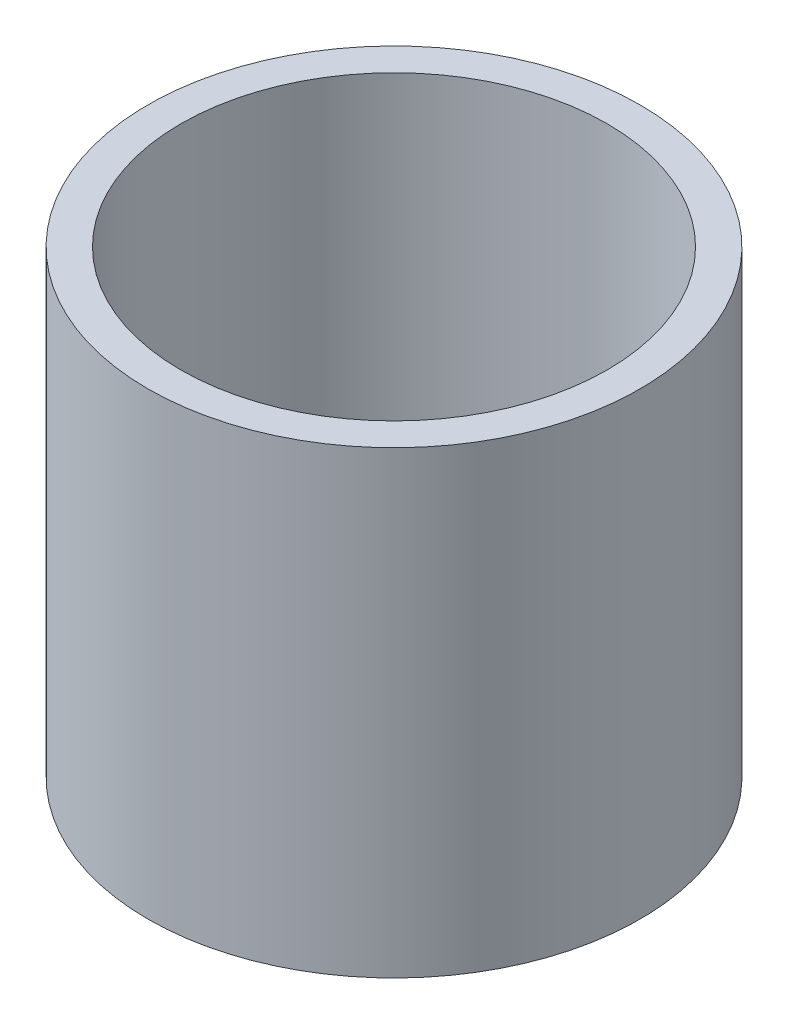
ISO-10303-21;
HEADER;
FILE_DESCRIPTION(('STEP AP214'),'2;1');
FILE_NAME('part.step','',(''),(''),'','','');
FILE_SCHEMA(('AUTOMOTIVE_DESIGN { 1 0 10303 214 1 1 1 1 }'));
ENDSEC;
DATA;
#1=APPLICATION_CONTEXT('core data for automotive mechanical design processes');
#2=APPLICATION_PROTOCOL_DEFINITION('international standard','automotive_design',2000,#1);
#3=PRODUCT_CONTEXT('',#1,'mechanical');
#4=PRODUCT('Part','Part','',(#3));
#5=PRODUCT_RELATED_PRODUCT_CATEGORY('part','',(#4));
#6=PRODUCT_DEFINITION_FORMATION('','',#4);
#7=PRODUCT_DEFINITION_CONTEXT('part definition',#1,'design');
#8=PRODUCT_DEFINITION('design','',#6,#7);
#9=PRODUCT_DEFINITION_SHAPE('','',#8);
#10=(LENGTH_UNIT() NAMED_UNIT(*) SI_UNIT(.MILLI.,.METRE.));
#11=(NAMED_UNIT(*) PLANE_ANGLE_UNIT() SI_UNIT($,.RADIAN.));
#12=(NAMED_UNIT(*) SI_UNIT($,.STERADIAN.) SOLID_ANGLE_UNIT());
#13=UNCERTAINTY_MEASURE_WITH_UNIT(LENGTH_MEASURE(1.E-05),#10,'distance_accuracy_value','');
#14=(GEOMETRIC_REPRESENTATION_CONTEXT(3) GLOBAL_UNCERTAINTY_ASSIGNED_CONTEXT((#13)) GLOBAL_UNIT_ASSIGNED_CONTEXT((#10,
#11,#12)) REPRESENTATION_CONTEXT('',''));
#15=CARTESIAN_POINT('',(0.,0.,0.));
#16=DIRECTION('',(0.,0.,1.));
#17=DIRECTION('',(1.,0.,0.));
#18=AXIS2_PLACEMENT_3D('',#15,#16,#17);
#19=CARTESIAN_POINT('',(0.,70.,0.));
#20=DIRECTION('',(0.,-1.,0.));
#21=DIRECTION('',(0.,0.,-1.));
#22=AXIS2_PLACEMENT_3D('',#19,#20,#21);
#23=CYLINDRICAL_SURFACE('',#22,37.5);
#24=CARTESIAN_POINT('',(0.,70.,0.));
#25=DIRECTION('',(0.,1.,0.));
#26=DIRECTION('',(0.,0.,1.));
#27=AXIS2_PLACEMENT_3D('',#24,#25,#26);
#28=CIRCLE('',#27,37.5);
#29=CARTESIAN_POINT('',(0.,70.,37.5));
#30=VERTEX_POINT('',#29);
#31=EDGE_CURVE('E10',#30,#30,#28,.T.);
#32=ORIENTED_EDGE('',*,*,#31,.F.);
#33=EDGE_LOOP('',(#32));
#34=FACE_BOUND('',#33,.T.);
#35=CARTESIAN_POINT('',(0.,0.,0.));
#36=DIRECTION('',(0.,1.,0.));
#37=DIRECTION('',(0.,0.,1.));
#38=AXIS2_PLACEMENT_3D('',#35,#36,#37);
#39=CIRCLE('',#38,37.5);
#40=CARTESIAN_POINT('',(0.,0.,37.5));
#41=VERTEX_POINT('',#40);
#42=EDGE_CURVE('E45',#41,#41,#39,.T.);
#43=ORIENTED_EDGE('',*,*,#42,.T.);
#44=EDGE_LOOP('',(#43));
#45=FACE_BOUND('',#44,.T.);
#46=ADVANCED_FACE('F37',(#34,#45),#23,.T.);
#47=CARTESIAN_POINT('',(0.,70.,0.));
#48=DIRECTION('',(0.,1.,0.));
#49=DIRECTION('',(0.,0.,1.));
#50=AXIS2_PLACEMENT_3D('',#47,#48,#49);
#51=PLANE('',#50);
#52=CARTESIAN_POINT('',(0.,70.,0.));
#53=DIRECTION('',(0.,1.,0.));
#54=DIRECTION('',(0.,0.,1.));
#55=AXIS2_PLACEMENT_3D('',#52,#53,#54);
#56=CIRCLE('',#55,32.5);
#57=CARTESIAN_POINT('',(0.,70.,32.5));
#58=VERTEX_POINT('',#57);
#59=EDGE_CURVE('E53',#58,#58,#56,.T.);
#60=ORIENTED_EDGE('',*,*,#59,.F.);
#61=EDGE_LOOP('',(#60));
#62=FACE_BOUND('',#61,.T.);
#63=ORIENTED_EDGE('',*,*,#31,.T.);
#64=EDGE_LOOP('',(#63));
#65=FACE_BOUND('',#64,.T.);
#66=ADVANCED_FACE('F84',(#62,#65),#51,.T.);
#67=CARTESIAN_POINT('',(0.,0.,0.));
#68=DIRECTION('',(0.,1.,0.));
#69=DIRECTION('',(0.,0.,1.));
#70=AXIS2_PLACEMENT_3D('',#67,#68,#69);
#71=PLANE('',#70);
#72=CARTESIAN_POINT('',(0.,0.,0.));
#73=DIRECTION('',(0.,-1.,0.));
#74=DIRECTION('',(0.,0.,-1.));
#75=AXIS2_PLACEMENT_3D('',#72,#73,#74);
#76=CIRCLE('',#75,14.5);
#77=CARTESIAN_POINT('',(0.,0.,-14.5));
#78=VERTEX_POINT('',#77);
#79=EDGE_CURVE('E60',#78,#78,#76,.T.);
#80=ORIENTED_EDGE('',*,*,#79,.F.);
#81=EDGE_LOOP('',(#80));
#82=FACE_BOUND('',#81,.T.);
#83=ORIENTED_EDGE('',*,*,#42,.F.);
#84=EDGE_LOOP('',(#83));
#85=FACE_BOUND('',#84,.T.);
#86=ADVANCED_FACE('F80',(#82,#85),#71,.F.);
#87=CARTESIAN_POINT('',(0.,10.,0.));
#88=DIRECTION('',(0.,1.,0.));
#89=DIRECTION('',(0.,0.,1.));
#90=AXIS2_PLACEMENT_3D('',#87,#88,#89);
#91=CYLINDRICAL_SURFACE('',#90,32.5);
#92=CARTESIAN_POINT('',(0.,10.,0.));
#93=DIRECTION('',(0.,1.,0.));
#94=DIRECTION('',(0.,0.,1.));
#95=AXIS2_PLACEMENT_3D('',#92,#93,#94);
#96=CIRCLE('',#95,32.5);
#97=CARTESIAN_POINT('',(0.,10.,32.5));
#98=VERTEX_POINT('',#97);
#99=EDGE_CURVE('E51',#98,#98,#96,.T.);
#100=ORIENTED_EDGE('',*,*,#99,.F.);
#101=EDGE_LOOP('',(#100));
#102=FACE_BOUND('',#101,.T.);
#103=ORIENTED_EDGE('',*,*,#59,.T.);
#104=EDGE_LOOP('',(#103));
#105=FACE_BOUND('',#104,.T.);
#106=ADVANCED_FACE('F74',(#102,#105),#91,.F.);
#107=CARTESIAN_POINT('',(0.,10.,0.));
#108=DIRECTION('',(0.,1.,0.));
#109=DIRECTION('',(0.,0.,1.));
#110=AXIS2_PLACEMENT_3D('',#107,#108,#109);
#111=PLANE('',#110);
#112=CARTESIAN_POINT('',(0.,10.,0.));
#113=DIRECTION('',(0.,1.,0.));
#114=DIRECTION('',(0.,0.,1.));
#115=AXIS2_PLACEMENT_3D('',#112,#113,#114);
#116=CIRCLE('',#115,14.5);
#117=CARTESIAN_POINT('',(0.,10.,14.5));
#118=VERTEX_POINT('',#117);
#119=EDGE_CURVE('E40',#118,#118,#116,.T.);
#120=ORIENTED_EDGE('',*,*,#119,.F.);
#121=EDGE_LOOP('',(#120));
#122=FACE_BOUND('',#121,.T.);
#123=ORIENTED_EDGE('',*,*,#99,.T.);
#124=EDGE_LOOP('',(#123));
#125=FACE_BOUND('',#124,.T.);
#126=ADVANCED_FACE('F71',(#122,#125),#111,.T.);
#127=CARTESIAN_POINT('',(0.,40.,0.));
#128=DIRECTION('',(0.,-1.,0.));
#129=DIRECTION('',(0.,0.,-1.));
#130=AXIS2_PLACEMENT_3D('',#127,#128,#129);
#131=CYLINDRICAL_SURFACE('',#130,14.5);
#132=ORIENTED_EDGE('',*,*,#119,.T.);
#133=EDGE_LOOP('',(#132));
#134=FACE_BOUND('',#133,.T.);
#135=ORIENTED_EDGE('',*,*,#79,.T.);
#136=EDGE_LOOP('',(#135));
#137=FACE_BOUND('',#136,.T.);
#138=ADVANCED_FACE('F69',(#134,#137),#131,.F.);
#139=CLOSED_SHELL('',(#46,#66,#86,#106,#126,#138));
#140=MANIFOLD_SOLID_BREP('B2',#139);
#141=ADVANCED_BREP_SHAPE_REPRESENTATION('',(#18,#140),#14);
#142=SHAPE_DEFINITION_REPRESENTATION(#9,#141);
ENDSEC;
END-ISO-10303-21;
